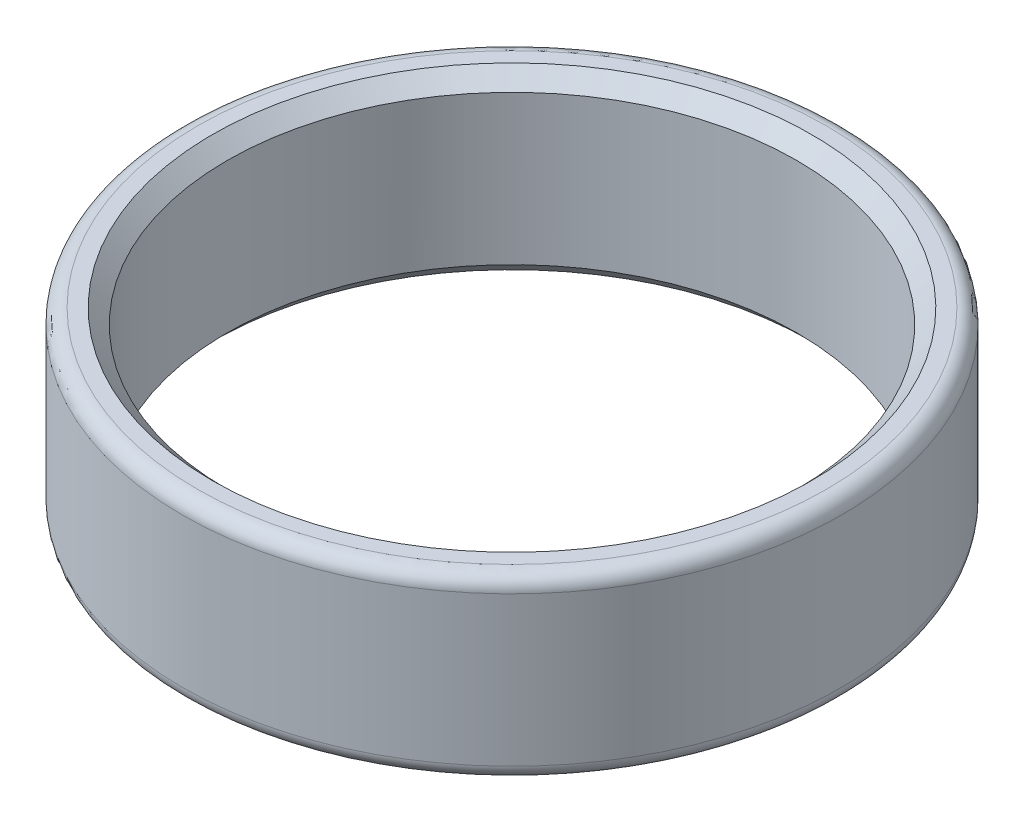
ISO-10303-21;
HEADER;
FILE_DESCRIPTION(('STEP AP214'),'2;1');
FILE_NAME('part.step','',(''),(''),'','','');
FILE_SCHEMA(('AUTOMOTIVE_DESIGN { 1 0 10303 214 1 1 1 1 }'));
ENDSEC;
DATA;
#1=APPLICATION_CONTEXT('core data for automotive mechanical design processes');
#2=APPLICATION_PROTOCOL_DEFINITION('international standard','automotive_design',2000,#1);
#3=PRODUCT_CONTEXT('',#1,'mechanical');
#4=PRODUCT('Part','Part','',(#3));
#5=PRODUCT_RELATED_PRODUCT_CATEGORY('part','',(#4));
#6=PRODUCT_DEFINITION_FORMATION('','',#4);
#7=PRODUCT_DEFINITION_CONTEXT('part definition',#1,'design');
#8=PRODUCT_DEFINITION('design','',#6,#7);
#9=PRODUCT_DEFINITION_SHAPE('','',#8);
#10=(LENGTH_UNIT() NAMED_UNIT(*) SI_UNIT(.MILLI.,.METRE.));
#11=(NAMED_UNIT(*) PLANE_ANGLE_UNIT() SI_UNIT($,.RADIAN.));
#12=(NAMED_UNIT(*) SI_UNIT($,.STERADIAN.) SOLID_ANGLE_UNIT());
#13=UNCERTAINTY_MEASURE_WITH_UNIT(LENGTH_MEASURE(1.E-05),#10,'distance_accuracy_value','');
#14=(GEOMETRIC_REPRESENTATION_CONTEXT(3) GLOBAL_UNCERTAINTY_ASSIGNED_CONTEXT((#13)) GLOBAL_UNIT_ASSIGNED_CONTEXT((#10,
#11,#12)) REPRESENTATION_CONTEXT('',''));
#15=CARTESIAN_POINT('',(0.,0.,0.));
#16=DIRECTION('',(0.,0.,1.));
#17=DIRECTION('',(1.,0.,0.));
#18=AXIS2_PLACEMENT_3D('',#15,#16,#17);
#19=CARTESIAN_POINT('',(0.,19.05,0.));
#20=DIRECTION('',(0.,1.,0.));
#21=DIRECTION('',(0.,0.,1.));
#22=AXIS2_PLACEMENT_3D('',#19,#20,#21);
#23=PLANE('',#22);
#24=CARTESIAN_POINT('',(0.,19.05,0.));
#25=DIRECTION('',(0.,1.,0.));
#26=DIRECTION('',(0.,0.,1.));
#27=AXIS2_PLACEMENT_3D('',#24,#25,#26);
#28=CIRCLE('',#27,31.877);
#29=CARTESIAN_POINT('',(0.,19.05,31.877));
#30=VERTEX_POINT('',#29);
#31=EDGE_CURVE('E10',#30,#30,#28,.F.);
#32=ORIENTED_EDGE('',*,*,#31,.T.);
#33=EDGE_LOOP('',(#32));
#34=FACE_BOUND('',#33,.T.);
#35=CARTESIAN_POINT('',(0.,19.05,0.));
#36=DIRECTION('',(0.,1.,0.));
#37=DIRECTION('',(0.,0.,1.));
#38=AXIS2_PLACEMENT_3D('',#35,#36,#37);
#39=CIRCLE('',#38,33.4645);
#40=CARTESIAN_POINT('',(0.,19.05,33.4645));
#41=VERTEX_POINT('',#40);
#42=EDGE_CURVE('E56',#41,#41,#39,.T.);
#43=ORIENTED_EDGE('',*,*,#42,.T.);
#44=EDGE_LOOP('',(#43));
#45=FACE_BOUND('',#44,.T.);
#46=ADVANCED_FACE('F35',(#34,#45),#23,.T.);
#47=CARTESIAN_POINT('',(0.,0.,0.));
#48=DIRECTION('',(0.,1.,0.));
#49=DIRECTION('',(0.,0.,1.));
#50=AXIS2_PLACEMENT_3D('',#47,#48,#49);
#51=PLANE('',#50);
#52=CARTESIAN_POINT('',(0.,0.,0.));
#53=DIRECTION('',(0.,1.,0.));
#54=DIRECTION('',(0.,0.,1.));
#55=AXIS2_PLACEMENT_3D('',#52,#53,#54);
#56=CIRCLE('',#55,31.877);
#57=CARTESIAN_POINT('',(0.,0.,31.877));
#58=VERTEX_POINT('',#57);
#59=EDGE_CURVE('E51',#58,#58,#56,.T.);
#60=ORIENTED_EDGE('',*,*,#59,.T.);
#61=EDGE_LOOP('',(#60));
#62=FACE_BOUND('',#61,.T.);
#63=CARTESIAN_POINT('',(0.,0.,0.));
#64=DIRECTION('',(0.,1.,0.));
#65=DIRECTION('',(0.,0.,1.));
#66=AXIS2_PLACEMENT_3D('',#63,#64,#65);
#67=CIRCLE('',#66,33.4645);
#68=CARTESIAN_POINT('',(0.,0.,33.4645));
#69=VERTEX_POINT('',#68);
#70=EDGE_CURVE('E59',#69,#69,#67,.F.);
#71=ORIENTED_EDGE('',*,*,#70,.T.);
#72=EDGE_LOOP('',(#71));
#73=FACE_BOUND('',#72,.T.);
#74=ADVANCED_FACE('F80',(#62,#73),#51,.F.);
#75=CARTESIAN_POINT('',(0.,19.05,0.));
#76=DIRECTION('',(0.,-1.,0.));
#77=DIRECTION('',(0.,0.,-1.));
#78=AXIS2_PLACEMENT_3D('',#75,#76,#77);
#79=CYLINDRICAL_SURFACE('',#78,35.052);
#80=CARTESIAN_POINT('',(0.,1.5875,0.));
#81=DIRECTION('',(0.,1.,0.));
#82=DIRECTION('',(0.,0.,1.));
#83=AXIS2_PLACEMENT_3D('',#80,#81,#82);
#84=CIRCLE('',#83,35.052);
#85=CARTESIAN_POINT('',(0.,1.5875,-35.052));
#86=VERTEX_POINT('',#85);
#87=EDGE_CURVE('E62',#86,#86,#84,.T.);
#88=CARTESIAN_POINT('',(0.,17.4625,0.));
#89=DIRECTION('',(0.,1.,0.));
#90=DIRECTION('',(0.,0.,1.));
#91=AXIS2_PLACEMENT_3D('',#88,#89,#90);
#92=CIRCLE('',#91,35.052);
#93=CARTESIAN_POINT('',(0.,17.4625,-35.052));
#94=VERTEX_POINT('',#93);
#95=EDGE_CURVE('E65',#94,#94,#92,.F.);
#96=CARTESIAN_POINT('',(0.,1.5875,-35.052));
#97=CARTESIAN_POINT('',(0.,1.75286458333333,-35.052));
#98=CARTESIAN_POINT('',(0.,1.91822916666666,-35.052));
#99=CARTESIAN_POINT('',(0.,2.24895833333333,-35.052));
#100=CARTESIAN_POINT('',(0.,2.41432291666667,-35.052));
#101=CARTESIAN_POINT('',(0.,2.74505208333333,-35.052));
#102=CARTESIAN_POINT('',(0.,2.91041666666667,-35.052));
#103=CARTESIAN_POINT('',(0.,3.24114583333333,-35.052));
#104=CARTESIAN_POINT('',(0.,3.40651041666666,-35.052));
#105=CARTESIAN_POINT('',(0.,3.73723958333333,-35.052));
#106=CARTESIAN_POINT('',(0.,3.90260416666666,-35.052));
#107=CARTESIAN_POINT('',(0.,4.23333333333333,-35.052));
#108=CARTESIAN_POINT('',(0.,4.39869791666667,-35.052));
#109=CARTESIAN_POINT('',(0.,4.72942708333333,-35.052));
#110=CARTESIAN_POINT('',(0.,4.89479166666666,-35.052));
#111=CARTESIAN_POINT('',(0.,5.22552083333333,-35.052));
#112=CARTESIAN_POINT('',(0.,5.39088541666667,-35.052));
#113=CARTESIAN_POINT('',(0.,5.72161458333333,-35.052));
#114=CARTESIAN_POINT('',(0.,5.88697916666667,-35.052));
#115=CARTESIAN_POINT('',(0.,6.21770833333333,-35.052));
#116=CARTESIAN_POINT('',(0.,6.38307291666667,-35.052));
#117=CARTESIAN_POINT('',(0.,6.71380208333333,-35.052));
#118=CARTESIAN_POINT('',(0.,6.87916666666667,-35.052));
#119=CARTESIAN_POINT('',(0.,7.20989583333333,-35.052));
#120=CARTESIAN_POINT('',(0.,7.37526041666667,-35.052));
#121=CARTESIAN_POINT('',(0.,7.70598958333333,-35.052));
#122=CARTESIAN_POINT('',(0.,7.87135416666667,-35.052));
#123=CARTESIAN_POINT('',(0.,8.20208333333333,-35.052));
#124=CARTESIAN_POINT('',(0.,8.36744791666667,-35.052));
#125=CARTESIAN_POINT('',(0.,8.69817708333333,-35.052));
#126=CARTESIAN_POINT('',(0.,8.86354166666667,-35.052));
#127=CARTESIAN_POINT('',(0.,9.19427083333333,-35.052));
#128=CARTESIAN_POINT('',(0.,9.35963541666667,-35.052));
#129=CARTESIAN_POINT('',(0.,9.69036458333333,-35.052));
#130=CARTESIAN_POINT('',(0.,9.85572916666667,-35.052));
#131=CARTESIAN_POINT('',(0.,10.1864583333333,-35.052));
#132=CARTESIAN_POINT('',(0.,10.3518229166667,-35.052));
#133=CARTESIAN_POINT('',(0.,10.6825520833333,-35.052));
#134=CARTESIAN_POINT('',(0.,10.8479166666667,-35.052));
#135=CARTESIAN_POINT('',(0.,11.1786458333333,-35.052));
#136=CARTESIAN_POINT('',(0.,11.3440104166667,-35.052));
#137=CARTESIAN_POINT('',(0.,11.6747395833333,-35.052));
#138=CARTESIAN_POINT('',(0.,11.8401041666667,-35.052));
#139=CARTESIAN_POINT('',(0.,12.1708333333333,-35.052));
#140=CARTESIAN_POINT('',(0.,12.3361979166667,-35.052));
#141=CARTESIAN_POINT('',(0.,12.6669270833333,-35.052));
#142=CARTESIAN_POINT('',(0.,12.8322916666667,-35.052));
#143=CARTESIAN_POINT('',(0.,13.1630208333333,-35.052));
#144=CARTESIAN_POINT('',(0.,13.3283854166667,-35.052));
#145=CARTESIAN_POINT('',(0.,13.6591145833333,-35.052));
#146=CARTESIAN_POINT('',(0.,13.8244791666667,-35.052));
#147=CARTESIAN_POINT('',(0.,14.1552083333333,-35.052));
#148=CARTESIAN_POINT('',(0.,14.3205729166667,-35.052));
#149=CARTESIAN_POINT('',(0.,14.6513020833333,-35.052));
#150=CARTESIAN_POINT('',(0.,14.8166666666667,-35.052));
#151=CARTESIAN_POINT('',(0.,15.1473958333333,-35.052));
#152=CARTESIAN_POINT('',(0.,15.3127604166667,-35.052));
#153=CARTESIAN_POINT('',(0.,15.6434895833333,-35.052));
#154=CARTESIAN_POINT('',(0.,15.8088541666667,-35.052));
#155=CARTESIAN_POINT('',(0.,16.1395833333333,-35.052));
#156=CARTESIAN_POINT('',(0.,16.3049479166667,-35.052));
#157=CARTESIAN_POINT('',(0.,16.6356770833333,-35.052));
#158=CARTESIAN_POINT('',(0.,16.8010416666667,-35.052));
#159=CARTESIAN_POINT('',(0.,17.1317708333333,-35.052));
#160=CARTESIAN_POINT('',(0.,17.2971354166667,-35.052));
#161=CARTESIAN_POINT('',(0.,17.4625,-35.052));
#162=B_SPLINE_CURVE_WITH_KNOTS('',3,(#96,#97,#98,#99,#100,#101,#102,#103,#104,#105,#106,#107,
#108,#109,#110,#111,#112,#113,#114,#115,#116,#117,#118,#119,#120,#121,#122,#123,#124,#125,#126,
#127,#128,#129,#130,#131,#132,#133,#134,#135,#136,#137,#138,#139,#140,#141,#142,#143,#144,#145,
#146,#147,#148,#149,#150,#151,#152,#153,#154,#155,#156,#157,#158,#159,#160,#161),.UNSPECIFIED.,
.F.,.F.,(4,2,2,2,2,2,2,2,2,2,2,2,2,2,2,2,2,2,2,2,2,2,2,2,2,2,2,2,2,2,2,2,4),(0.,
0.496093749999999,0.992187500000002,1.48828125,1.984375,2.48046875,2.9765625,3.47265625,3.96875,
4.46484375,4.9609375,5.45703125,5.953125,6.44921875,6.9453125,7.44140625,7.9375,8.43359375,
8.9296875,9.42578125,9.921875,10.41796875,10.9140625,11.41015625,11.90625,12.40234375,
12.8984375,13.39453125,13.890625,14.38671875,14.8828125,15.37890625,15.875),.UNSPECIFIED.);
#163=EDGE_CURVE('BSEAM69',#86,#94,#162,.T.);
#164=ORIENTED_EDGE('',*,*,#87,.T.);
#165=ORIENTED_EDGE('',*,*,#95,.T.);
#166=ORIENTED_EDGE('',*,*,#163,.T.);
#167=ORIENTED_EDGE('',*,*,#163,.F.);
#168=EDGE_LOOP('',(#164,#166,#165,#167));
#169=FACE_BOUND('',#168,.T.);
#170=ADVANCED_FACE('F69',(#169),#79,.T.);
#171=CARTESIAN_POINT('',(0.,19.05,0.));
#172=DIRECTION('',(0.,-1.,0.));
#173=DIRECTION('',(0.,0.,-1.));
#174=AXIS2_PLACEMENT_3D('',#171,#172,#173);
#175=CYLINDRICAL_SURFACE('',#174,30.2895);
#176=CARTESIAN_POINT('',(0.,1.58749999999998,0.));
#177=DIRECTION('',(0.,1.,0.));
#178=DIRECTION('',(0.,0.,1.));
#179=AXIS2_PLACEMENT_3D('',#176,#177,#178);
#180=CIRCLE('',#179,30.2895);
#181=CARTESIAN_POINT('',(0.,1.58749999999998,-30.2895));
#182=VERTEX_POINT('',#181);
#183=EDGE_CURVE('E43',#182,#182,#180,.F.);
#184=CARTESIAN_POINT('',(0.,17.4625,0.));
#185=DIRECTION('',(0.,1.,0.));
#186=DIRECTION('',(0.,0.,1.));
#187=AXIS2_PLACEMENT_3D('',#184,#185,#186);
#188=CIRCLE('',#187,30.2895);
#189=CARTESIAN_POINT('',(0.,17.4625,-30.2895));
#190=VERTEX_POINT('',#189);
#191=EDGE_CURVE('E47',#190,#190,#188,.T.);
#192=CARTESIAN_POINT('',(0.,1.58749999999998,-30.2895));
#193=CARTESIAN_POINT('',(0.,1.75286458333331,-30.2895));
#194=CARTESIAN_POINT('',(0.,1.91822916666664,-30.2895));
#195=CARTESIAN_POINT('',(0.,2.24895833333331,-30.2895));
#196=CARTESIAN_POINT('',(0.,2.41432291666664,-30.2895));
#197=CARTESIAN_POINT('',(0.,2.74505208333331,-30.2895));
#198=CARTESIAN_POINT('',(0.,2.91041666666664,-30.2895));
#199=CARTESIAN_POINT('',(0.,3.24114583333331,-30.2895));
#200=CARTESIAN_POINT('',(0.,3.40651041666664,-30.2895));
#201=CARTESIAN_POINT('',(0.,3.73723958333331,-30.2895));
#202=CARTESIAN_POINT('',(0.,3.90260416666664,-30.2895));
#203=CARTESIAN_POINT('',(0.,4.23333333333331,-30.2895));
#204=CARTESIAN_POINT('',(0.,4.39869791666664,-30.2895));
#205=CARTESIAN_POINT('',(0.,4.72942708333331,-30.2895));
#206=CARTESIAN_POINT('',(0.,4.89479166666664,-30.2895));
#207=CARTESIAN_POINT('',(0.,5.22552083333331,-30.2895));
#208=CARTESIAN_POINT('',(0.,5.39088541666664,-30.2895));
#209=CARTESIAN_POINT('',(0.,5.72161458333331,-30.2895));
#210=CARTESIAN_POINT('',(0.,5.88697916666664,-30.2895));
#211=CARTESIAN_POINT('',(0.,6.21770833333331,-30.2895));
#212=CARTESIAN_POINT('',(0.,6.38307291666664,-30.2895));
#213=CARTESIAN_POINT('',(0.,6.71380208333331,-30.2895));
#214=CARTESIAN_POINT('',(0.,6.87916666666664,-30.2895));
#215=CARTESIAN_POINT('',(0.,7.20989583333331,-30.2895));
#216=CARTESIAN_POINT('',(0.,7.37526041666664,-30.2895));
#217=CARTESIAN_POINT('',(0.,7.70598958333331,-30.2895));
#218=CARTESIAN_POINT('',(0.,7.87135416666664,-30.2895));
#219=CARTESIAN_POINT('',(0.,8.20208333333331,-30.2895));
#220=CARTESIAN_POINT('',(0.,8.36744791666664,-30.2895));
#221=CARTESIAN_POINT('',(0.,8.69817708333331,-30.2895));
#222=CARTESIAN_POINT('',(0.,8.86354166666664,-30.2895));
#223=CARTESIAN_POINT('',(0.,9.19427083333331,-30.2895));
#224=CARTESIAN_POINT('',(0.,9.35963541666664,-30.2895));
#225=CARTESIAN_POINT('',(0.,9.69036458333331,-30.2895));
#226=CARTESIAN_POINT('',(0.,9.85572916666664,-30.2895));
#227=CARTESIAN_POINT('',(0.,10.1864583333333,-30.2895));
#228=CARTESIAN_POINT('',(0.,10.3518229166666,-30.2895));
#229=CARTESIAN_POINT('',(0.,10.6825520833333,-30.2895));
#230=CARTESIAN_POINT('',(0.,10.8479166666666,-30.2895));
#231=CARTESIAN_POINT('',(0.,11.1786458333333,-30.2895));
#232=CARTESIAN_POINT('',(0.,11.3440104166666,-30.2895));
#233=CARTESIAN_POINT('',(0.,11.6747395833333,-30.2895));
#234=CARTESIAN_POINT('',(0.,11.8401041666666,-30.2895));
#235=CARTESIAN_POINT('',(0.,12.1708333333333,-30.2895));
#236=CARTESIAN_POINT('',(0.,12.3361979166666,-30.2895));
#237=CARTESIAN_POINT('',(0.,12.6669270833333,-30.2895));
#238=CARTESIAN_POINT('',(0.,12.8322916666666,-30.2895));
#239=CARTESIAN_POINT('',(0.,13.1630208333333,-30.2895));
#240=CARTESIAN_POINT('',(0.,13.3283854166666,-30.2895));
#241=CARTESIAN_POINT('',(0.,13.6591145833333,-30.2895));
#242=CARTESIAN_POINT('',(0.,13.8244791666666,-30.2895));
#243=CARTESIAN_POINT('',(0.,14.1552083333333,-30.2895));
#244=CARTESIAN_POINT('',(0.,14.3205729166666,-30.2895));
#245=CARTESIAN_POINT('',(0.,14.6513020833333,-30.2895));
#246=CARTESIAN_POINT('',(0.,14.8166666666666,-30.2895));
#247=CARTESIAN_POINT('',(0.,15.1473958333333,-30.2895));
#248=CARTESIAN_POINT('',(0.,15.3127604166666,-30.2895));
#249=CARTESIAN_POINT('',(0.,15.6434895833333,-30.2895));
#250=CARTESIAN_POINT('',(0.,15.8088541666666,-30.2895));
#251=CARTESIAN_POINT('',(0.,16.1395833333333,-30.2895));
#252=CARTESIAN_POINT('',(0.,16.3049479166666,-30.2895));
#253=CARTESIAN_POINT('',(0.,16.6356770833333,-30.2895));
#254=CARTESIAN_POINT('',(0.,16.8010416666666,-30.2895));
#255=CARTESIAN_POINT('',(0.,17.1317708333333,-30.2895));
#256=CARTESIAN_POINT('',(0.,17.2971354166666,-30.2895));
#257=CARTESIAN_POINT('',(0.,17.4625,-30.2895));
#258=B_SPLINE_CURVE_WITH_KNOTS('',3,(#192,#193,#194,#195,#196,#197,#198,#199,#200,#201,#202,
#203,#204,#205,#206,#207,#208,#209,#210,#211,#212,#213,#214,#215,#216,#217,#218,#219,#220,#221,
#222,#223,#224,#225,#226,#227,#228,#229,#230,#231,#232,#233,#234,#235,#236,#237,#238,#239,#240,
#241,#242,#243,#244,#245,#246,#247,#248,#249,#250,#251,#252,#253,#254,#255,#256,#257),
.UNSPECIFIED.,.F.,.F.,(4,2,2,2,2,2,2,2,2,2,2,2,2,2,2,2,2,2,2,2,2,2,2,2,2,2,2,2,2,2,2,2,4),(0.,
0.496093749999999,0.992187499999998,1.48828125,1.984375,2.48046875,2.9765625,3.47265625,3.96875,
4.46484375,4.9609375,5.45703125,5.953125,6.44921875,6.9453125,7.44140625,7.9375,8.43359375,
8.9296875,9.42578125,9.921875,10.41796875,10.9140625,11.41015625,11.90625,12.40234375,
12.8984375,13.39453125,13.890625,14.38671875,14.8828125,15.37890625,15.875),.UNSPECIFIED.);
#259=EDGE_CURVE('BSEAM88',#182,#190,#258,.T.);
#260=ORIENTED_EDGE('',*,*,#183,.T.);
#261=ORIENTED_EDGE('',*,*,#191,.T.);
#262=ORIENTED_EDGE('',*,*,#259,.T.);
#263=ORIENTED_EDGE('',*,*,#259,.F.);
#264=EDGE_LOOP('',(#260,#262,#261,#263));
#265=FACE_BOUND('',#264,.T.);
#266=ADVANCED_FACE('F88',(#265),#175,.F.);
#267=CARTESIAN_POINT('',(0.,1.5875,0.));
#268=DIRECTION('',(0.,1.,0.));
#269=DIRECTION('',(0.,0.,1.));
#270=AXIS2_PLACEMENT_3D('',#267,#268,#269);
#271=TOROIDAL_SURFACE('',#270,33.4645,1.5875);
#272=ORIENTED_EDGE('',*,*,#70,.F.);
#273=EDGE_LOOP('',(#272));
#274=FACE_BOUND('',#273,.T.);
#275=ORIENTED_EDGE('',*,*,#87,.F.);
#276=EDGE_LOOP('',(#275));
#277=FACE_BOUND('',#276,.T.);
#278=ADVANCED_FACE('F75',(#274,#277),#271,.T.);
#279=CARTESIAN_POINT('',(0.,17.4625,0.));
#280=DIRECTION('',(0.,1.,0.));
#281=DIRECTION('',(0.,0.,1.));
#282=AXIS2_PLACEMENT_3D('',#279,#280,#281);
#283=TOROIDAL_SURFACE('',#282,33.4645,1.5875);
#284=ORIENTED_EDGE('',*,*,#95,.F.);
#285=EDGE_LOOP('',(#284));
#286=FACE_BOUND('',#285,.T.);
#287=ORIENTED_EDGE('',*,*,#42,.F.);
#288=EDGE_LOOP('',(#287));
#289=FACE_BOUND('',#288,.T.);
#290=ADVANCED_FACE('F71',(#286,#289),#283,.T.);
#291=CARTESIAN_POINT('',(0.,0.,0.));
#292=DIRECTION('',(0.,-1.,0.));
#293=DIRECTION('',(0.,0.,-1.));
#294=AXIS2_PLACEMENT_3D('',#291,#292,#293);
#295=CONICAL_SURFACE('',#294,31.877,0.785398163397446);
#296=ORIENTED_EDGE('',*,*,#183,.F.);
#297=EDGE_LOOP('',(#296));
#298=FACE_BOUND('',#297,.T.);
#299=ORIENTED_EDGE('',*,*,#59,.F.);
#300=EDGE_LOOP('',(#299));
#301=FACE_BOUND('',#300,.T.);
#302=ADVANCED_FACE('F74',(#298,#301),#295,.F.);
#303=CARTESIAN_POINT('',(0.,17.4625,0.));
#304=DIRECTION('',(0.,1.,0.));
#305=DIRECTION('',(0.,0.,1.));
#306=AXIS2_PLACEMENT_3D('',#303,#304,#305);
#307=CONICAL_SURFACE('',#306,30.2895,0.785398163397445);
#308=ORIENTED_EDGE('',*,*,#31,.F.);
#309=EDGE_LOOP('',(#308));
#310=FACE_BOUND('',#309,.T.);
#311=ORIENTED_EDGE('',*,*,#191,.F.);
#312=EDGE_LOOP('',(#311));
#313=FACE_BOUND('',#312,.T.);
#314=ADVANCED_FACE('F38',(#310,#313),#307,.F.);
#315=CLOSED_SHELL('',(#46,#74,#170,#266,#278,#290,#302,#314));
#316=MANIFOLD_SOLID_BREP('B2',#315);
#317=ADVANCED_BREP_SHAPE_REPRESENTATION('',(#18,#316),#14);
#318=SHAPE_DEFINITION_REPRESENTATION(#9,#317);
ENDSEC;
END-ISO-10303-21;
